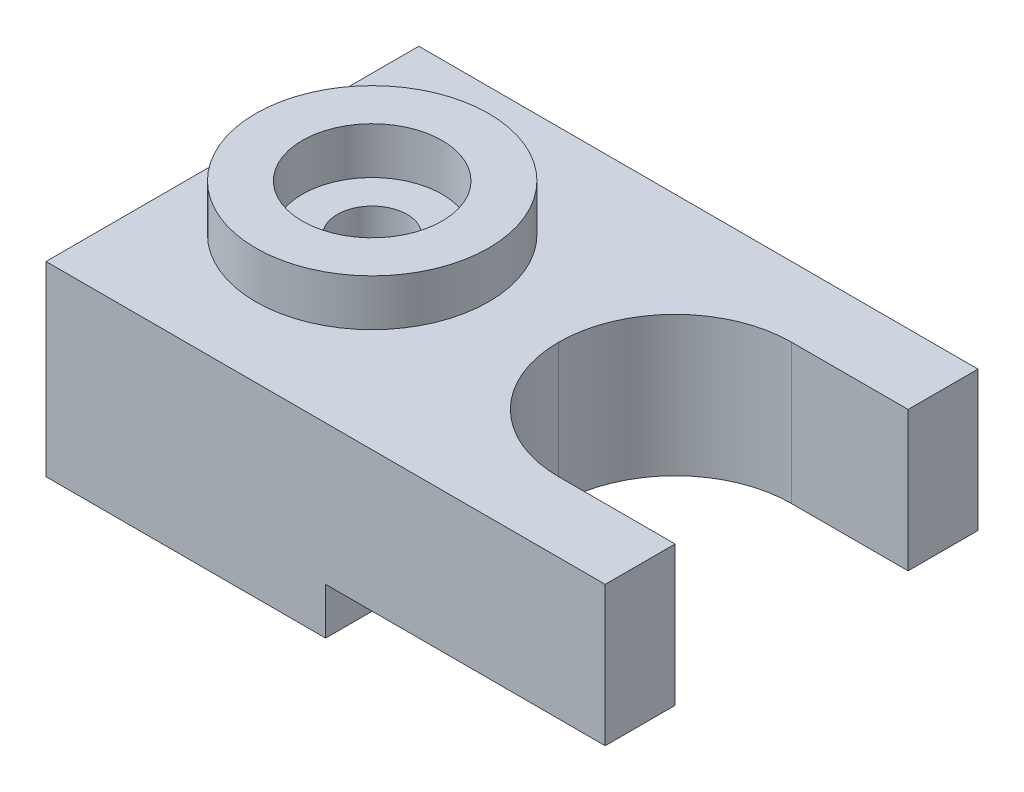
ISO-10303-21;
HEADER;
FILE_DESCRIPTION(('STEP AP214'),'2;1');
FILE_NAME('part.step','',(''),(''),'','','');
FILE_SCHEMA(('AUTOMOTIVE_DESIGN { 1 0 10303 214 1 1 1 1 }'));
ENDSEC;
DATA;
#1=APPLICATION_CONTEXT('core data for automotive mechanical design processes');
#2=APPLICATION_PROTOCOL_DEFINITION('international standard','automotive_design',2000,#1);
#3=PRODUCT_CONTEXT('',#1,'mechanical');
#4=PRODUCT('Part','Part','',(#3));
#5=PRODUCT_RELATED_PRODUCT_CATEGORY('part','',(#4));
#6=PRODUCT_DEFINITION_FORMATION('','',#4);
#7=PRODUCT_DEFINITION_CONTEXT('part definition',#1,'design');
#8=PRODUCT_DEFINITION('design','',#6,#7);
#9=PRODUCT_DEFINITION_SHAPE('','',#8);
#10=(LENGTH_UNIT() NAMED_UNIT(*) SI_UNIT(.MILLI.,.METRE.));
#11=(NAMED_UNIT(*) PLANE_ANGLE_UNIT() SI_UNIT($,.RADIAN.));
#12=(NAMED_UNIT(*) SI_UNIT($,.STERADIAN.) SOLID_ANGLE_UNIT());
#13=UNCERTAINTY_MEASURE_WITH_UNIT(LENGTH_MEASURE(1.E-05),#10,'distance_accuracy_value','');
#14=(GEOMETRIC_REPRESENTATION_CONTEXT(3) GLOBAL_UNCERTAINTY_ASSIGNED_CONTEXT((#13)) GLOBAL_UNIT_ASSIGNED_CONTEXT((#10,
#11,#12)) REPRESENTATION_CONTEXT('',''));
#15=CARTESIAN_POINT('',(0.,0.,0.));
#16=DIRECTION('',(0.,0.,1.));
#17=DIRECTION('',(1.,0.,0.));
#18=AXIS2_PLACEMENT_3D('',#15,#16,#17);
#19=CARTESIAN_POINT('',(38.1,-12.7,25.4));
#20=DIRECTION('',(-1.,0.,0.));
#21=DIRECTION('',(0.,0.,1.));
#22=AXIS2_PLACEMENT_3D('',#19,#20,#21);
#23=PLANE('',#22);
#24=DIRECTION('',(0.,0.,1.));
#25=VECTOR('',#24,1.);
#26=CARTESIAN_POINT('',(38.1,-6.35,-25.4));
#27=LINE('',#26,#25);
#28=CARTESIAN_POINT('',(38.1,-6.35000000000001,15.875));
#29=VERTEX_POINT('',#28);
#30=CARTESIAN_POINT('',(38.1,-6.35,25.4));
#31=VERTEX_POINT('',#30);
#32=EDGE_CURVE('E218',#29,#31,#27,.T.);
#33=ORIENTED_EDGE('',*,*,#32,.F.);
#34=DIRECTION('',(0.,1.,0.));
#35=VECTOR('',#34,1.);
#36=CARTESIAN_POINT('',(38.1,-12.7,15.875));
#37=LINE('',#36,#35);
#38=CARTESIAN_POINT('',(38.1,12.7,15.875));
#39=VERTEX_POINT('',#38);
#40=EDGE_CURVE('E140',#29,#39,#37,.T.);
#41=ORIENTED_EDGE('',*,*,#40,.T.);
#42=DIRECTION('',(0.,0.,-1.));
#43=VECTOR('',#42,1.);
#44=CARTESIAN_POINT('',(38.1,12.7,25.4));
#45=LINE('',#44,#43);
#46=CARTESIAN_POINT('',(38.1,12.7,25.4));
#47=VERTEX_POINT('',#46);
#48=EDGE_CURVE('E156',#47,#39,#45,.T.);
#49=ORIENTED_EDGE('',*,*,#48,.F.);
#50=DIRECTION('',(0.,1.,0.));
#51=VECTOR('',#50,1.);
#52=CARTESIAN_POINT('',(38.1,-12.7,25.4));
#53=LINE('',#52,#51);
#54=EDGE_CURVE('E234',#31,#47,#53,.T.);
#55=ORIENTED_EDGE('',*,*,#54,.F.);
#56=EDGE_LOOP('',(#33,#41,#49,#55));
#57=FACE_BOUND('',#56,.T.);
#58=ADVANCED_FACE('F45',(#57),#23,.F.);
#59=CARTESIAN_POINT('',(38.1,12.7,-15.875));
#60=VERTEX_POINT('',#59);
#61=CARTESIAN_POINT('',(38.1,12.7,-25.4));
#62=VERTEX_POINT('',#61);
#63=EDGE_CURVE('E145',#60,#62,#45,.T.);
#64=ORIENTED_EDGE('',*,*,#63,.F.);
#65=DIRECTION('',(0.,1.,0.));
#66=VECTOR('',#65,1.);
#67=CARTESIAN_POINT('',(38.1,-12.7,-15.875));
#68=LINE('',#67,#66);
#69=CARTESIAN_POINT('',(38.1,-6.35000000000001,-15.875));
#70=VERTEX_POINT('',#69);
#71=EDGE_CURVE('E129',#70,#60,#68,.T.);
#72=ORIENTED_EDGE('',*,*,#71,.F.);
#73=CARTESIAN_POINT('',(38.1,-6.35,-25.4));
#74=VERTEX_POINT('',#73);
#75=EDGE_CURVE('E231',#74,#70,#27,.T.);
#76=ORIENTED_EDGE('',*,*,#75,.F.);
#77=DIRECTION('',(0.,1.,0.));
#78=VECTOR('',#77,1.);
#79=CARTESIAN_POINT('',(38.1,-12.7,-25.4));
#80=LINE('',#79,#78);
#81=EDGE_CURVE('E153',#74,#62,#80,.T.);
#82=ORIENTED_EDGE('',*,*,#81,.T.);
#83=EDGE_LOOP('',(#64,#72,#76,#82));
#84=FACE_BOUND('',#83,.T.);
#85=ADVANCED_FACE('F151',(#84),#23,.F.);
#86=CARTESIAN_POINT('',(-38.1,12.7,25.4));
#87=DIRECTION('',(0.,-1.,0.));
#88=DIRECTION('',(0.,0.,-1.));
#89=AXIS2_PLACEMENT_3D('',#86,#87,#88);
#90=PLANE('',#89);
#91=CARTESIAN_POINT('',(-19.05,12.7,0.));
#92=DIRECTION('',(0.,-1.,0.));
#93=DIRECTION('',(0.,0.,-1.));
#94=AXIS2_PLACEMENT_3D('',#91,#92,#93);
#95=CIRCLE('',#94,15.875);
#96=CARTESIAN_POINT('',(-19.05,12.7,-15.875));
#97=VERTEX_POINT('',#96);
#98=EDGE_CURVE('E11',#97,#97,#95,.F.);
#99=ORIENTED_EDGE('',*,*,#98,.F.);
#100=EDGE_LOOP('',(#99));
#101=FACE_BOUND('',#100,.T.);
#102=ORIENTED_EDGE('',*,*,#48,.T.);
#103=DIRECTION('',(1.,0.,0.));
#104=VECTOR('',#103,1.);
#105=CARTESIAN_POINT('',(38.1,12.7,15.875));
#106=LINE('',#105,#104);
#107=CARTESIAN_POINT('',(22.225,12.7,15.875));
#108=VERTEX_POINT('',#107);
#109=EDGE_CURVE('E141',#108,#39,#106,.T.);
#110=ORIENTED_EDGE('',*,*,#109,.F.);
#111=CARTESIAN_POINT('',(22.225,12.7,0.));
#112=DIRECTION('',(0.,-1.,0.));
#113=DIRECTION('',(0.,0.,-1.));
#114=AXIS2_PLACEMENT_3D('',#111,#112,#113);
#115=CIRCLE('',#114,15.875);
#116=CARTESIAN_POINT('',(6.35,12.7,0.));
#117=VERTEX_POINT('',#116);
#118=EDGE_CURVE('E68',#108,#117,#115,.T.);
#119=ORIENTED_EDGE('',*,*,#118,.T.);
#120=CARTESIAN_POINT('',(22.225,12.7,0.));
#121=DIRECTION('',(0.,-1.,0.));
#122=DIRECTION('',(0.,0.,-1.));
#123=AXIS2_PLACEMENT_3D('',#120,#121,#122);
#124=CIRCLE('',#123,15.875);
#125=CARTESIAN_POINT('',(22.225,12.7,-15.875));
#126=VERTEX_POINT('',#125);
#127=EDGE_CURVE('E147',#117,#126,#124,.T.);
#128=ORIENTED_EDGE('',*,*,#127,.T.);
#129=DIRECTION('',(-1.,0.,0.));
#130=VECTOR('',#129,1.);
#131=CARTESIAN_POINT('',(38.1,12.7,-15.875));
#132=LINE('',#131,#130);
#133=EDGE_CURVE('E132',#60,#126,#132,.T.);
#134=ORIENTED_EDGE('',*,*,#133,.F.);
#135=ORIENTED_EDGE('',*,*,#63,.T.);
#136=DIRECTION('',(-1.,0.,0.));
#137=VECTOR('',#136,1.);
#138=CARTESIAN_POINT('',(-38.1,12.7,-25.4));
#139=LINE('',#138,#137);
#140=CARTESIAN_POINT('',(-38.1,12.7,-25.4));
#141=VERTEX_POINT('',#140);
#142=EDGE_CURVE('E250',#62,#141,#139,.T.);
#143=ORIENTED_EDGE('',*,*,#142,.T.);
#144=DIRECTION('',(0.,0.,-1.));
#145=VECTOR('',#144,1.);
#146=CARTESIAN_POINT('',(-38.1,12.7,25.4));
#147=LINE('',#146,#145);
#148=CARTESIAN_POINT('',(-38.1,12.7,25.4));
#149=VERTEX_POINT('',#148);
#150=EDGE_CURVE('E157',#149,#141,#147,.T.);
#151=ORIENTED_EDGE('',*,*,#150,.F.);
#152=DIRECTION('',(-1.,0.,0.));
#153=VECTOR('',#152,1.);
#154=CARTESIAN_POINT('',(-38.1,12.7,25.4));
#155=LINE('',#154,#153);
#156=EDGE_CURVE('E237',#47,#149,#155,.T.);
#157=ORIENTED_EDGE('',*,*,#156,.F.);
#158=EDGE_LOOP('',(#102,#110,#119,#128,#134,#135,#143,#151,#157));
#159=FACE_BOUND('',#158,.T.);
#160=ADVANCED_FACE('F144',(#101,#159),#90,.F.);
#161=CARTESIAN_POINT('',(-38.1,-12.7,25.4));
#162=DIRECTION('',(1.,0.,0.));
#163=DIRECTION('',(0.,0.,-1.));
#164=AXIS2_PLACEMENT_3D('',#161,#162,#163);
#165=PLANE('',#164);
#166=DIRECTION('',(0.,-1.,0.));
#167=VECTOR('',#166,1.);
#168=CARTESIAN_POINT('',(-38.1,-12.7,-25.4));
#169=LINE('',#168,#167);
#170=CARTESIAN_POINT('',(-38.1,-12.7,-25.4));
#171=VERTEX_POINT('',#170);
#172=EDGE_CURVE('E253',#141,#171,#169,.T.);
#173=ORIENTED_EDGE('',*,*,#172,.T.);
#174=DIRECTION('',(0.,0.,-1.));
#175=VECTOR('',#174,1.);
#176=CARTESIAN_POINT('',(-38.1,-12.7,25.4));
#177=LINE('',#176,#175);
#178=CARTESIAN_POINT('',(-38.1,-12.7,25.4));
#179=VERTEX_POINT('',#178);
#180=EDGE_CURVE('E162',#179,#171,#177,.T.);
#181=ORIENTED_EDGE('',*,*,#180,.F.);
#182=DIRECTION('',(0.,-1.,0.));
#183=VECTOR('',#182,1.);
#184=CARTESIAN_POINT('',(-38.1,-12.7,25.4));
#185=LINE('',#184,#183);
#186=EDGE_CURVE('E241',#149,#179,#185,.T.);
#187=ORIENTED_EDGE('',*,*,#186,.F.);
#188=ORIENTED_EDGE('',*,*,#150,.T.);
#189=EDGE_LOOP('',(#173,#181,#187,#188));
#190=FACE_BOUND('',#189,.T.);
#191=ADVANCED_FACE('F282',(#190),#165,.F.);
#192=CARTESIAN_POINT('',(-38.1,-12.7,25.4));
#193=DIRECTION('',(0.,1.,0.));
#194=DIRECTION('',(0.,0.,1.));
#195=AXIS2_PLACEMENT_3D('',#192,#193,#194);
#196=PLANE('',#195);
#197=CARTESIAN_POINT('',(-19.05,-12.7,0.));
#198=DIRECTION('',(0.,1.,0.));
#199=DIRECTION('',(0.,0.,1.));
#200=AXIS2_PLACEMENT_3D('',#197,#198,#199);
#201=CIRCLE('',#200,4.7625);
#202=CARTESIAN_POINT('',(-19.05,-12.7,4.7625));
#203=VERTEX_POINT('',#202);
#204=EDGE_CURVE('E193',#203,#203,#201,.T.);
#205=ORIENTED_EDGE('',*,*,#204,.T.);
#206=EDGE_LOOP('',(#205));
#207=FACE_BOUND('',#206,.T.);
#208=DIRECTION('',(1.,0.,0.));
#209=VECTOR('',#208,1.);
#210=CARTESIAN_POINT('',(-38.1,-12.7,-25.4));
#211=LINE('',#210,#209);
#212=CARTESIAN_POINT('',(0.,-12.7,-25.4));
#213=VERTEX_POINT('',#212);
#214=EDGE_CURVE('E238',#171,#213,#211,.T.);
#215=ORIENTED_EDGE('',*,*,#214,.T.);
#216=DIRECTION('',(0.,0.,1.));
#217=VECTOR('',#216,1.);
#218=CARTESIAN_POINT('',(0.,-12.7,-25.4));
#219=LINE('',#218,#217);
#220=CARTESIAN_POINT('',(0.,-12.7,25.4));
#221=VERTEX_POINT('',#220);
#222=EDGE_CURVE('E224',#213,#221,#219,.T.);
#223=ORIENTED_EDGE('',*,*,#222,.T.);
#224=DIRECTION('',(1.,0.,0.));
#225=VECTOR('',#224,1.);
#226=CARTESIAN_POINT('',(-38.1,-12.7,25.4));
#227=LINE('',#226,#225);
#228=EDGE_CURVE('E244',#179,#221,#227,.T.);
#229=ORIENTED_EDGE('',*,*,#228,.F.);
#230=ORIENTED_EDGE('',*,*,#180,.T.);
#231=EDGE_LOOP('',(#215,#223,#229,#230));
#232=FACE_BOUND('',#231,.T.);
#233=ADVANCED_FACE('F264',(#207,#232),#196,.F.);
#234=CARTESIAN_POINT('',(0.,0.,25.4));
#235=DIRECTION('',(0.,0.,-1.));
#236=DIRECTION('',(-1.,0.,0.));
#237=AXIS2_PLACEMENT_3D('',#234,#235,#236);
#238=PLANE('',#237);
#239=ORIENTED_EDGE('',*,*,#228,.T.);
#240=DIRECTION('',(0.,-1.,0.));
#241=VECTOR('',#240,1.);
#242=CARTESIAN_POINT('',(0.,-12.7,25.4));
#243=LINE('',#242,#241);
#244=CARTESIAN_POINT('',(0.,-6.35000000000001,25.4));
#245=VERTEX_POINT('',#244);
#246=EDGE_CURVE('E214',#245,#221,#243,.T.);
#247=ORIENTED_EDGE('',*,*,#246,.F.);
#248=DIRECTION('',(-1.,0.,0.));
#249=VECTOR('',#248,1.);
#250=CARTESIAN_POINT('',(38.1,-6.35,25.4));
#251=LINE('',#250,#249);
#252=EDGE_CURVE('E207',#31,#245,#251,.T.);
#253=ORIENTED_EDGE('',*,*,#252,.F.);
#254=ORIENTED_EDGE('',*,*,#54,.T.);
#255=ORIENTED_EDGE('',*,*,#156,.T.);
#256=ORIENTED_EDGE('',*,*,#186,.T.);
#257=EDGE_LOOP('',(#239,#247,#253,#254,#255,#256));
#258=FACE_BOUND('',#257,.T.);
#259=ADVANCED_FACE('F279',(#258),#238,.F.);
#260=CARTESIAN_POINT('',(0.,0.,-25.4));
#261=DIRECTION('',(0.,0.,-1.));
#262=DIRECTION('',(-1.,0.,0.));
#263=AXIS2_PLACEMENT_3D('',#260,#261,#262);
#264=PLANE('',#263);
#265=DIRECTION('',(0.,-1.,0.));
#266=VECTOR('',#265,1.);
#267=CARTESIAN_POINT('',(0.,-12.7,-25.4));
#268=LINE('',#267,#266);
#269=CARTESIAN_POINT('',(0.,-6.35000000000001,-25.4));
#270=VERTEX_POINT('',#269);
#271=EDGE_CURVE('E213',#270,#213,#268,.T.);
#272=ORIENTED_EDGE('',*,*,#271,.T.);
#273=ORIENTED_EDGE('',*,*,#214,.F.);
#274=ORIENTED_EDGE('',*,*,#172,.F.);
#275=ORIENTED_EDGE('',*,*,#142,.F.);
#276=ORIENTED_EDGE('',*,*,#81,.F.);
#277=DIRECTION('',(-1.,0.,0.));
#278=VECTOR('',#277,1.);
#279=CARTESIAN_POINT('',(38.1,-6.35,-25.4));
#280=LINE('',#279,#278);
#281=EDGE_CURVE('E209',#74,#270,#280,.T.);
#282=ORIENTED_EDGE('',*,*,#281,.T.);
#283=EDGE_LOOP('',(#272,#273,#274,#275,#276,#282));
#284=FACE_BOUND('',#283,.T.);
#285=ADVANCED_FACE('F269',(#284),#264,.T.);
#286=CARTESIAN_POINT('',(0.,-12.7,-25.4));
#287=DIRECTION('',(-1.,0.,0.));
#288=DIRECTION('',(0.,0.,1.));
#289=AXIS2_PLACEMENT_3D('',#286,#287,#288);
#290=PLANE('',#289);
#291=ORIENTED_EDGE('',*,*,#246,.T.);
#292=ORIENTED_EDGE('',*,*,#222,.F.);
#293=ORIENTED_EDGE('',*,*,#271,.F.);
#294=DIRECTION('',(0.,0.,1.));
#295=VECTOR('',#294,1.);
#296=CARTESIAN_POINT('',(0.,-6.35000000000001,-25.4));
#297=LINE('',#296,#295);
#298=EDGE_CURVE('E228',#270,#245,#297,.T.);
#299=ORIENTED_EDGE('',*,*,#298,.T.);
#300=EDGE_LOOP('',(#291,#292,#293,#299));
#301=FACE_BOUND('',#300,.T.);
#302=ADVANCED_FACE('F272',(#301),#290,.F.);
#303=CARTESIAN_POINT('',(38.1,-6.35,-25.4));
#304=DIRECTION('',(0.,1.,0.));
#305=DIRECTION('',(-1.,0.,0.));
#306=AXIS2_PLACEMENT_3D('',#303,#304,#305);
#307=PLANE('',#306);
#308=DIRECTION('',(-1.,0.,0.));
#309=VECTOR('',#308,1.);
#310=CARTESIAN_POINT('',(38.1,-6.35,-15.875));
#311=LINE('',#310,#309);
#312=CARTESIAN_POINT('',(22.225,-6.35000000000001,-15.875));
#313=VERTEX_POINT('',#312);
#314=EDGE_CURVE('E134',#70,#313,#311,.T.);
#315=ORIENTED_EDGE('',*,*,#314,.T.);
#316=CARTESIAN_POINT('',(22.225,-6.35000000000001,0.));
#317=DIRECTION('',(0.,1.,0.));
#318=DIRECTION('',(-1.,0.,0.));
#319=AXIS2_PLACEMENT_3D('',#316,#317,#318);
#320=CIRCLE('',#319,15.875);
#321=CARTESIAN_POINT('',(6.35,-6.35000000000001,0.));
#322=VERTEX_POINT('',#321);
#323=EDGE_CURVE('E54',#313,#322,#320,.T.);
#324=ORIENTED_EDGE('',*,*,#323,.T.);
#325=CARTESIAN_POINT('',(22.225,-6.35000000000001,0.));
#326=DIRECTION('',(0.,1.,0.));
#327=DIRECTION('',(-1.,0.,0.));
#328=AXIS2_PLACEMENT_3D('',#325,#326,#327);
#329=CIRCLE('',#328,15.875);
#330=CARTESIAN_POINT('',(22.225,-6.35000000000001,15.875));
#331=VERTEX_POINT('',#330);
#332=EDGE_CURVE('E180',#322,#331,#329,.T.);
#333=ORIENTED_EDGE('',*,*,#332,.T.);
#334=DIRECTION('',(1.,0.,0.));
#335=VECTOR('',#334,1.);
#336=CARTESIAN_POINT('',(38.1,-6.35,15.875));
#337=LINE('',#336,#335);
#338=EDGE_CURVE('E168',#331,#29,#337,.T.);
#339=ORIENTED_EDGE('',*,*,#338,.T.);
#340=ORIENTED_EDGE('',*,*,#32,.T.);
#341=ORIENTED_EDGE('',*,*,#252,.T.);
#342=ORIENTED_EDGE('',*,*,#298,.F.);
#343=ORIENTED_EDGE('',*,*,#281,.F.);
#344=ORIENTED_EDGE('',*,*,#75,.T.);
#345=EDGE_LOOP('',(#315,#324,#333,#339,#340,#341,#342,#343,#344));
#346=FACE_BOUND('',#345,.T.);
#347=ADVANCED_FACE('F273',(#346),#307,.F.);
#348=CARTESIAN_POINT('',(38.1,-12.7,15.875));
#349=DIRECTION('',(0.,0.,1.));
#350=DIRECTION('',(1.,0.,0.));
#351=AXIS2_PLACEMENT_3D('',#348,#349,#350);
#352=PLANE('',#351);
#353=ORIENTED_EDGE('',*,*,#338,.F.);
#354=DIRECTION('',(0.,1.,0.));
#355=VECTOR('',#354,1.);
#356=CARTESIAN_POINT('',(22.225,12.7,15.875));
#357=LINE('',#356,#355);
#358=EDGE_CURVE('E171',#331,#108,#357,.T.);
#359=ORIENTED_EDGE('',*,*,#358,.T.);
#360=ORIENTED_EDGE('',*,*,#109,.T.);
#361=ORIENTED_EDGE('',*,*,#40,.F.);
#362=EDGE_LOOP('',(#353,#359,#360,#361));
#363=FACE_BOUND('',#362,.T.);
#364=ADVANCED_FACE('F288',(#363),#352,.F.);
#365=CARTESIAN_POINT('',(38.1,-12.7,-15.875));
#366=DIRECTION('',(0.,0.,-1.));
#367=DIRECTION('',(-1.,0.,0.));
#368=AXIS2_PLACEMENT_3D('',#365,#366,#367);
#369=PLANE('',#368);
#370=ORIENTED_EDGE('',*,*,#133,.T.);
#371=DIRECTION('',(0.,1.,0.));
#372=VECTOR('',#371,1.);
#373=CARTESIAN_POINT('',(22.225,-6.35000000000001,-15.875));
#374=LINE('',#373,#372);
#375=EDGE_CURVE('E175',#126,#313,#374,.F.);
#376=ORIENTED_EDGE('',*,*,#375,.T.);
#377=ORIENTED_EDGE('',*,*,#314,.F.);
#378=ORIENTED_EDGE('',*,*,#71,.T.);
#379=EDGE_LOOP('',(#370,#376,#377,#378));
#380=FACE_BOUND('',#379,.T.);
#381=ADVANCED_FACE('F131',(#380),#369,.F.);
#382=CARTESIAN_POINT('',(22.225,-12.7,0.));
#383=DIRECTION('',(0.,-1.,0.));
#384=DIRECTION('',(0.,0.,-1.));
#385=AXIS2_PLACEMENT_3D('',#382,#383,#384);
#386=CYLINDRICAL_SURFACE('',#385,15.875);
#387=DIRECTION('',(0.,1.,0.));
#388=VECTOR('',#387,1.);
#389=CARTESIAN_POINT('',(6.35,12.7,0.));
#390=LINE('',#389,#388);
#391=EDGE_CURVE('E149',#322,#117,#390,.T.);
#392=ORIENTED_EDGE('',*,*,#391,.F.);
#393=ORIENTED_EDGE('',*,*,#323,.F.);
#394=ORIENTED_EDGE('',*,*,#375,.F.);
#395=ORIENTED_EDGE('',*,*,#127,.F.);
#396=EDGE_LOOP('',(#392,#393,#394,#395));
#397=FACE_BOUND('',#396,.T.);
#398=ADVANCED_FACE('F47',(#397),#386,.F.);
#399=CARTESIAN_POINT('',(22.225,-12.7,0.));
#400=DIRECTION('',(0.,-1.,0.));
#401=DIRECTION('',(0.,0.,-1.));
#402=AXIS2_PLACEMENT_3D('',#399,#400,#401);
#403=CYLINDRICAL_SURFACE('',#402,15.875);
#404=ORIENTED_EDGE('',*,*,#332,.F.);
#405=ORIENTED_EDGE('',*,*,#391,.T.);
#406=ORIENTED_EDGE('',*,*,#118,.F.);
#407=ORIENTED_EDGE('',*,*,#358,.F.);
#408=EDGE_LOOP('',(#404,#405,#406,#407));
#409=FACE_BOUND('',#408,.T.);
#410=ADVANCED_FACE('F290',(#409),#403,.F.);
#411=CARTESIAN_POINT('',(-19.05,19.05,0.));
#412=DIRECTION('',(0.,-1.,0.));
#413=DIRECTION('',(0.,0.,-1.));
#414=AXIS2_PLACEMENT_3D('',#411,#412,#413);
#415=CYLINDRICAL_SURFACE('',#414,15.875);
#416=CARTESIAN_POINT('',(-19.05,19.05,0.));
#417=DIRECTION('',(0.,1.,0.));
#418=DIRECTION('',(0.,0.,1.));
#419=AXIS2_PLACEMENT_3D('',#416,#417,#418);
#420=CIRCLE('',#419,15.875);
#421=CARTESIAN_POINT('',(-19.05,19.05,15.875));
#422=VERTEX_POINT('',#421);
#423=EDGE_CURVE('E188',#422,#422,#420,.T.);
#424=ORIENTED_EDGE('',*,*,#423,.F.);
#425=EDGE_LOOP('',(#424));
#426=FACE_BOUND('',#425,.T.);
#427=ORIENTED_EDGE('',*,*,#98,.T.);
#428=EDGE_LOOP('',(#427));
#429=FACE_BOUND('',#428,.T.);
#430=ADVANCED_FACE('F292',(#426,#429),#415,.T.);
#431=CARTESIAN_POINT('',(-19.05,19.05,0.));
#432=DIRECTION('',(0.,1.,0.));
#433=DIRECTION('',(0.,0.,1.));
#434=AXIS2_PLACEMENT_3D('',#431,#432,#433);
#435=PLANE('',#434);
#436=CARTESIAN_POINT('',(-19.05,19.05,0.));
#437=DIRECTION('',(0.,1.,0.));
#438=DIRECTION('',(0.,0.,1.));
#439=AXIS2_PLACEMENT_3D('',#436,#437,#438);
#440=CIRCLE('',#439,9.525);
#441=CARTESIAN_POINT('',(-19.05,19.05,9.525));
#442=VERTEX_POINT('',#441);
#443=EDGE_CURVE('E349',#442,#442,#440,.T.);
#444=ORIENTED_EDGE('',*,*,#443,.F.);
#445=EDGE_LOOP('',(#444));
#446=FACE_BOUND('',#445,.T.);
#447=ORIENTED_EDGE('',*,*,#423,.T.);
#448=EDGE_LOOP('',(#447));
#449=FACE_BOUND('',#448,.T.);
#450=ADVANCED_FACE('F298',(#446,#449),#435,.T.);
#451=CARTESIAN_POINT('',(-19.05,19.05,0.));
#452=DIRECTION('',(0.,1.,0.));
#453=DIRECTION('',(0.,0.,1.));
#454=AXIS2_PLACEMENT_3D('',#451,#452,#453);
#455=CYLINDRICAL_SURFACE('',#454,4.76250000000001);
#456=ORIENTED_EDGE('',*,*,#204,.F.);
#457=EDGE_LOOP('',(#456));
#458=FACE_BOUND('',#457,.T.);
#459=CARTESIAN_POINT('',(-19.05,12.7,0.));
#460=DIRECTION('',(0.,1.,0.));
#461=DIRECTION('',(0.,0.,1.));
#462=AXIS2_PLACEMENT_3D('',#459,#460,#461);
#463=CIRCLE('',#462,4.76250000000001);
#464=CARTESIAN_POINT('',(-19.05,12.7,4.76250000000001));
#465=VERTEX_POINT('',#464);
#466=EDGE_CURVE('E199',#465,#465,#463,.T.);
#467=ORIENTED_EDGE('',*,*,#466,.T.);
#468=EDGE_LOOP('',(#467));
#469=FACE_BOUND('',#468,.T.);
#470=ADVANCED_FACE('F329',(#458,#469),#455,.F.);
#471=CARTESIAN_POINT('',(-14.2875,12.7,0.));
#472=DIRECTION('',(0.,-1.,0.));
#473=DIRECTION('',(0.,0.,-1.));
#474=AXIS2_PLACEMENT_3D('',#471,#472,#473);
#475=PLANE('',#474);
#476=ORIENTED_EDGE('',*,*,#466,.F.);
#477=EDGE_LOOP('',(#476));
#478=FACE_BOUND('',#477,.T.);
#479=CARTESIAN_POINT('',(-19.05,12.7,0.));
#480=DIRECTION('',(0.,1.,0.));
#481=DIRECTION('',(0.,0.,1.));
#482=AXIS2_PLACEMENT_3D('',#479,#480,#481);
#483=CIRCLE('',#482,9.525);
#484=CARTESIAN_POINT('',(-19.05,12.7,9.525));
#485=VERTEX_POINT('',#484);
#486=EDGE_CURVE('E346',#485,#485,#483,.T.);
#487=ORIENTED_EDGE('',*,*,#486,.T.);
#488=EDGE_LOOP('',(#487));
#489=FACE_BOUND('',#488,.T.);
#490=ADVANCED_FACE('F333',(#478,#489),#475,.F.);
#491=CARTESIAN_POINT('',(-19.05,19.05,0.));
#492=DIRECTION('',(0.,1.,0.));
#493=DIRECTION('',(0.,0.,1.));
#494=AXIS2_PLACEMENT_3D('',#491,#492,#493);
#495=CYLINDRICAL_SURFACE('',#494,9.525);
#496=ORIENTED_EDGE('',*,*,#486,.F.);
#497=EDGE_LOOP('',(#496));
#498=FACE_BOUND('',#497,.T.);
#499=ORIENTED_EDGE('',*,*,#443,.T.);
#500=EDGE_LOOP('',(#499));
#501=FACE_BOUND('',#500,.T.);
#502=ADVANCED_FACE('F337',(#498,#501),#495,.F.);
#503=CLOSED_SHELL('',(#58,#85,#160,#191,#233,#259,#285,#302,#347,#364,#381,#398,#410,#430,#450,
#470,#490,#502));
#504=MANIFOLD_SOLID_BREP('B2',#503);
#505=ADVANCED_BREP_SHAPE_REPRESENTATION('',(#18,#504),#14);
#506=SHAPE_DEFINITION_REPRESENTATION(#9,#505);
ENDSEC;
END-ISO-10303-21;
